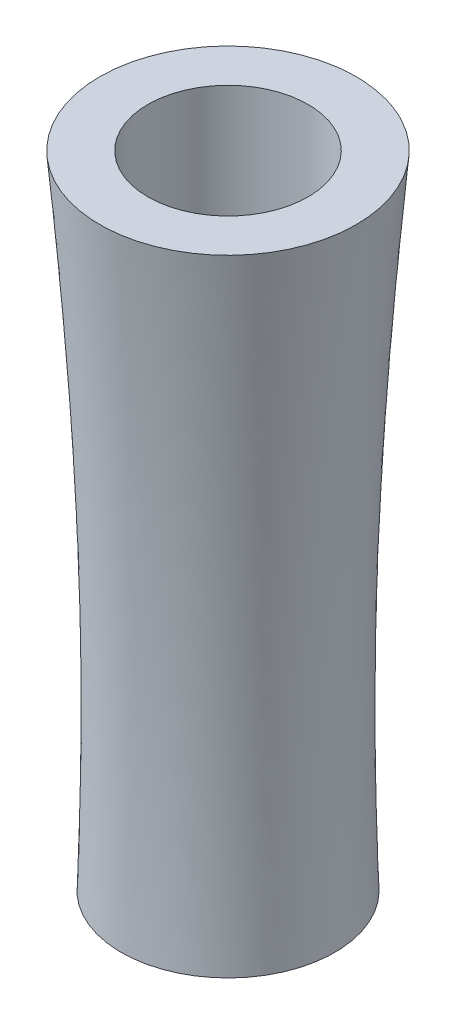
ISO-10303-21;
HEADER;
FILE_DESCRIPTION(('STEP AP214'),'2;1');
FILE_NAME('part.step','',(''),(''),'','','');
FILE_SCHEMA(('AUTOMOTIVE_DESIGN { 1 0 10303 214 1 1 1 1 }'));
ENDSEC;
DATA;
#1=APPLICATION_CONTEXT('core data for automotive mechanical design processes');
#2=APPLICATION_PROTOCOL_DEFINITION('international standard','automotive_design',2000,#1);
#3=PRODUCT_CONTEXT('',#1,'mechanical');
#4=PRODUCT('Part','Part','',(#3));
#5=PRODUCT_RELATED_PRODUCT_CATEGORY('part','',(#4));
#6=PRODUCT_DEFINITION_FORMATION('','',#4);
#7=PRODUCT_DEFINITION_CONTEXT('part definition',#1,'design');
#8=PRODUCT_DEFINITION('design','',#6,#7);
#9=PRODUCT_DEFINITION_SHAPE('','',#8);
#10=(LENGTH_UNIT() NAMED_UNIT(*) SI_UNIT(.MILLI.,.METRE.));
#11=(NAMED_UNIT(*) PLANE_ANGLE_UNIT() SI_UNIT($,.RADIAN.));
#12=(NAMED_UNIT(*) SI_UNIT($,.STERADIAN.) SOLID_ANGLE_UNIT());
#13=UNCERTAINTY_MEASURE_WITH_UNIT(LENGTH_MEASURE(1.E-05),#10,'distance_accuracy_value','');
#14=(GEOMETRIC_REPRESENTATION_CONTEXT(3) GLOBAL_UNCERTAINTY_ASSIGNED_CONTEXT((#13)) GLOBAL_UNIT_ASSIGNED_CONTEXT((#10,
#11,#12)) REPRESENTATION_CONTEXT('',''));
#15=CARTESIAN_POINT('',(0.,0.,0.));
#16=DIRECTION('',(0.,0.,1.));
#17=DIRECTION('',(1.,0.,0.));
#18=AXIS2_PLACEMENT_3D('',#15,#16,#17);
#19=CARTESIAN_POINT('',(0.,60.,0.));
#20=DIRECTION('',(0.,1.,0.));
#21=DIRECTION('',(0.,0.,1.));
#22=AXIS2_PLACEMENT_3D('',#19,#20,#21);
#23=PLANE('',#22);
#24=CARTESIAN_POINT('',(0.,60.,0.));
#25=DIRECTION('',(0.,1.,0.));
#26=DIRECTION('',(0.,0.,1.));
#27=AXIS2_PLACEMENT_3D('',#24,#25,#26);
#28=CIRCLE('',#27,7.5);
#29=CARTESIAN_POINT('',(0.,60.,7.5));
#30=VERTEX_POINT('',#29);
#31=EDGE_CURVE('E63',#30,#30,#28,.T.);
#32=ORIENTED_EDGE('',*,*,#31,.F.);
#33=EDGE_LOOP('',(#32));
#34=FACE_BOUND('',#33,.T.);
#35=CARTESIAN_POINT('',(0.,60.,0.));
#36=DIRECTION('',(0.,1.,0.));
#37=DIRECTION('',(0.,0.,1.));
#38=AXIS2_PLACEMENT_3D('',#35,#36,#37);
#39=CIRCLE('',#38,12.);
#40=CARTESIAN_POINT('',(-2.04829247959977,60.,11.8238952091946));
#41=VERTEX_POINT('',#40);
#42=EDGE_CURVE('E11',#41,#41,#39,.T.);
#43=ORIENTED_EDGE('',*,*,#42,.T.);
#44=EDGE_LOOP('',(#43));
#45=FACE_BOUND('',#44,.T.);
#46=ADVANCED_FACE('F47',(#34,#45),#23,.T.);
#47=CARTESIAN_POINT('',(0.,0.,0.));
#48=DIRECTION('',(0.,1.,0.));
#49=DIRECTION('',(0.,0.,1.));
#50=AXIS2_PLACEMENT_3D('',#47,#48,#49);
#51=PLANE('',#50);
#52=CARTESIAN_POINT('',(0.,0.,0.));
#53=DIRECTION('',(0.,1.,0.));
#54=DIRECTION('',(0.,0.,1.));
#55=AXIS2_PLACEMENT_3D('',#52,#53,#54);
#56=CIRCLE('',#55,7.5);
#57=CARTESIAN_POINT('',(0.,0.,7.5));
#58=VERTEX_POINT('',#57);
#59=EDGE_CURVE('E51',#58,#58,#56,.T.);
#60=ORIENTED_EDGE('',*,*,#59,.T.);
#61=EDGE_LOOP('',(#60));
#62=FACE_BOUND('',#61,.T.);
#63=CARTESIAN_POINT('',(0.,0.,0.));
#64=DIRECTION('',(0.,1.,0.));
#65=DIRECTION('',(0.,0.,1.));
#66=AXIS2_PLACEMENT_3D('',#63,#64,#65);
#67=CIRCLE('',#66,10.);
#68=CARTESIAN_POINT('',(6.31596393462323,0.,7.75297359575916));
#69=VERTEX_POINT('',#68);
#70=EDGE_CURVE('E56',#69,#69,#67,.T.);
#71=ORIENTED_EDGE('',*,*,#70,.F.);
#72=EDGE_LOOP('',(#71));
#73=FACE_BOUND('',#72,.T.);
#74=ADVANCED_FACE('F83',(#62,#73),#51,.F.);
#75=CARTESIAN_POINT('',(6.31596393462323,0.,7.75297359575916));
#76=CARTESIAN_POINT('',(-2.04829247959977,60.,11.8238952091946));
#77=CARTESIAN_POINT('',(21.8219111261415,0.,-4.8789542734873));
#78=CARTESIAN_POINT('',(21.5994979387894,60.,15.9204801683941));
#79=CARTESIAN_POINT('',(9.18998325689508,0.,-20.3849014650056));
#80=CARTESIAN_POINT('',(25.696082897989,60.,-7.72731024999507));
#81=CARTESIAN_POINT('',(-6.31596393462323,0.,-7.75297359575916));
#82=CARTESIAN_POINT('',(2.04829247959977,60.,-11.8238952091946));
#83=CARTESIAN_POINT('',(-21.8219111261415,0.,4.87895427348729));
#84=CARTESIAN_POINT('',(-21.5994979387894,60.,-15.9204801683941));
#85=CARTESIAN_POINT('',(-9.18998325689508,0.,20.3849014650056));
#86=CARTESIAN_POINT('',(-25.696082897989,60.,7.72731024999507));
#87=CARTESIAN_POINT('',(6.31596393462323,0.,7.75297359575916));
#88=CARTESIAN_POINT('',(-2.04829247959977,60.,11.8238952091946));
#89=(BOUNDED_SURFACE() B_SPLINE_SURFACE(3,1,((#75,#76),(#77,#78),(#79,#80),(#81,#82),(#83,#84),
(#85,#86),(#87,#88)),.UNSPECIFIED.,.T.,.F.,.F.) B_SPLINE_SURFACE_WITH_KNOTS((4,3,4),(2,2),(0.,
0.5,1.),(0.,1.),.UNSPECIFIED.) GEOMETRIC_REPRESENTATION_ITEM() RATIONAL_B_SPLINE_SURFACE(((1.,
1.),(0.333333333333333,0.333333333333333),(0.333333333333333,0.333333333333333),(1.,1.),
(0.333333333333334,0.333333333333333),(0.333333333333334,0.333333333333333),(1.,1.))) REPRESENTATION_ITEM('') SURFACE());
#90=CARTESIAN_POINT('',(6.31596393462323,0.,7.75297359575916));
#91=CARTESIAN_POINT('',(6.22883626364174,0.625,7.79537902923244));
#92=CARTESIAN_POINT('',(6.14170859266025,1.25,7.83778446270573));
#93=CARTESIAN_POINT('',(5.96745325069727,2.5,7.9225953296523));
#94=CARTESIAN_POINT('',(5.88032557971578,3.125,7.96500076312559));
#95=CARTESIAN_POINT('',(5.7060702377528,4.375,8.04981163007216));
#96=CARTESIAN_POINT('',(5.61894256677131,5.,8.09221706354544));
#97=CARTESIAN_POINT('',(5.44468722480833,6.25,8.17702793049201));
#98=CARTESIAN_POINT('',(5.35755955382684,6.875,8.2194333639653));
#99=CARTESIAN_POINT('',(5.18330421186386,8.125,8.30424423091187));
#100=CARTESIAN_POINT('',(5.09617654088237,8.75,8.34664966438516));
#101=CARTESIAN_POINT('',(4.9219211989194,10.,8.43146053133173));
#102=CARTESIAN_POINT('',(4.83479352793791,10.625,8.47386596480502));
#103=CARTESIAN_POINT('',(4.66053818597493,11.875,8.55867683175159));
#104=CARTESIAN_POINT('',(4.57341051499344,12.5,8.60108226522487));
#105=CARTESIAN_POINT('',(4.39915517303046,13.75,8.68589313217145));
#106=CARTESIAN_POINT('',(4.31202750204897,14.375,8.72829856564473));
#107=CARTESIAN_POINT('',(4.13777216008599,15.625,8.8131094325913));
#108=CARTESIAN_POINT('',(4.0506444891045,16.25,8.85551486606459));
#109=CARTESIAN_POINT('',(3.87638914714152,17.5,8.94032573301116));
#110=CARTESIAN_POINT('',(3.78926147616003,18.125,8.98273116648445));
#111=CARTESIAN_POINT('',(3.61500613419705,19.375,9.06754203343102));
#112=CARTESIAN_POINT('',(3.52787846321556,20.,9.10994746690431));
#113=CARTESIAN_POINT('',(3.35362312125258,21.25,9.19475833385088));
#114=CARTESIAN_POINT('',(3.26649545027109,21.875,9.23716376732416));
#115=CARTESIAN_POINT('',(3.09224010830811,23.125,9.32197463427073));
#116=CARTESIAN_POINT('',(3.00511243732663,23.75,9.36438006774402));
#117=CARTESIAN_POINT('',(2.83085709536365,25.,9.44919093469059));
#118=CARTESIAN_POINT('',(2.74372942438216,25.625,9.49159636816388));
#119=CARTESIAN_POINT('',(2.56947408241918,26.875,9.57640723511045));
#120=CARTESIAN_POINT('',(2.48234641143769,27.5,9.61881266858374));
#121=CARTESIAN_POINT('',(2.30809106947471,28.75,9.70362353553031));
#122=CARTESIAN_POINT('',(2.22096339849322,29.375,9.74602896900359));
#123=CARTESIAN_POINT('',(2.04670805653024,30.625,9.83083983595017));
#124=CARTESIAN_POINT('',(1.95958038554875,31.25,9.87324526942345));
#125=CARTESIAN_POINT('',(1.78532504358577,32.5,9.95805613637002));
#126=CARTESIAN_POINT('',(1.69819737260428,33.125,10.0004615698433));
#127=CARTESIAN_POINT('',(1.5239420306413,34.375,10.0852724367899));
#128=CARTESIAN_POINT('',(1.43681435965981,35.,10.1276778702632));
#129=CARTESIAN_POINT('',(1.26255901769683,36.25,10.2124887372097));
#130=CARTESIAN_POINT('',(1.17543134671534,36.875,10.254894170683));
#131=CARTESIAN_POINT('',(1.00117600475237,38.125,10.3397050376296));
#132=CARTESIAN_POINT('',(0.914048333770876,38.75,10.3821104711029));
#133=CARTESIAN_POINT('',(0.739792991807897,40.,10.4669213380495));
#134=CARTESIAN_POINT('',(0.652665320826407,40.625,10.5093267715227));
#135=CARTESIAN_POINT('',(0.478409978863428,41.875,10.5941376384693));
#136=CARTESIAN_POINT('',(0.391282307881939,42.5,10.6365430719426));
#137=CARTESIAN_POINT('',(0.21702696591896,43.75,10.7213539388892));
#138=CARTESIAN_POINT('',(0.12989929493747,44.375,10.7637593723625));
#139=CARTESIAN_POINT('',(-0.0443560470255091,45.625,10.848570239309));
#140=CARTESIAN_POINT('',(-0.131483718006999,46.25,10.8909756727823));
#141=CARTESIAN_POINT('',(-0.305739059969978,47.5,10.9757865397289));
#142=CARTESIAN_POINT('',(-0.392866730951467,48.125,11.0181919732022));
#143=CARTESIAN_POINT('',(-0.567122072914446,49.375,11.1030028401487));
#144=CARTESIAN_POINT('',(-0.654249743895936,50.,11.145408273622));
#145=CARTESIAN_POINT('',(-0.828505085858915,51.25,11.2302191405686));
#146=CARTESIAN_POINT('',(-0.915632756840405,51.875,11.2726245740419));
#147=CARTESIAN_POINT('',(-1.08988809880338,53.125,11.3574354409885));
#148=CARTESIAN_POINT('',(-1.17701576978487,53.75,11.3998408744617));
#149=CARTESIAN_POINT('',(-1.35127111174785,55.,11.4846517414083));
#150=CARTESIAN_POINT('',(-1.43839878272934,55.625,11.5270571748816));
#151=CARTESIAN_POINT('',(-1.61265412469232,56.875,11.6118680418282));
#152=CARTESIAN_POINT('',(-1.69978179567381,57.5,11.6542734753015));
#153=CARTESIAN_POINT('',(-1.87403713763679,58.75,11.739084342248));
#154=CARTESIAN_POINT('',(-1.96116480861828,59.375,11.7814897757213));
#155=CARTESIAN_POINT('',(-2.04829247959977,60.,11.8238952091946));
#156=B_SPLINE_CURVE_WITH_KNOTS('',3,(#90,#91,#92,#93,#94,#95,#96,#97,#98,#99,#100,#101,#102,
#103,#104,#105,#106,#107,#108,#109,#110,#111,#112,#113,#114,#115,#116,#117,#118,#119,#120,#121,
#122,#123,#124,#125,#126,#127,#128,#129,#130,#131,#132,#133,#134,#135,#136,#137,#138,#139,#140,
#141,#142,#143,#144,#145,#146,#147,#148,#149,#150,#151,#152,#153,#154,#155),.UNSPECIFIED.,.F.,
.F.,(4,2,2,2,2,2,2,2,2,2,2,2,2,2,2,2,2,2,2,2,2,2,2,2,2,2,2,2,2,2,2,2,4),(0.,1.89740087133648,
3.79480174267297,5.69220261400945,7.58960348534593,9.48700435668241,11.3844052280189,
13.2818060993554,15.1792069706919,17.0766078420283,18.9740087133648,20.8714095847013,
22.7688104560378,24.6662113273743,26.5636121987108,28.4610130700472,30.3584139413837,
32.2558148127202,34.1532156840567,36.0506165553932,37.9480174267296,39.8454182980661,
41.7428191694026,43.6402200407391,45.5376209120756,47.4350217834121,49.3324226547485,
51.229823526085,53.1272243974215,55.024625268758,56.9220261400945,58.8194270114309,
60.7168278827674),.UNSPECIFIED.);
#157=EDGE_CURVE('BSEAM92',#69,#41,#156,.T.);
#158=ORIENTED_EDGE('',*,*,#70,.T.);
#159=ORIENTED_EDGE('',*,*,#42,.F.);
#160=ORIENTED_EDGE('',*,*,#157,.T.);
#161=ORIENTED_EDGE('',*,*,#157,.F.);
#162=EDGE_LOOP('',(#158,#160,#159,#161));
#163=FACE_BOUND('',#162,.T.);
#164=ADVANCED_FACE('F92',(#163),#89,.T.);
#165=CARTESIAN_POINT('',(0.,-0.000100000000002876,0.));
#166=DIRECTION('',(0.,1.,0.));
#167=DIRECTION('',(0.,0.,1.));
#168=AXIS2_PLACEMENT_3D('',#165,#166,#167);
#169=CYLINDRICAL_SURFACE('',#168,7.5);
#170=ORIENTED_EDGE('',*,*,#31,.T.);
#171=EDGE_LOOP('',(#170));
#172=FACE_BOUND('',#171,.T.);
#173=ORIENTED_EDGE('',*,*,#59,.F.);
#174=EDGE_LOOP('',(#173));
#175=FACE_BOUND('',#174,.T.);
#176=ADVANCED_FACE('F94',(#172,#175),#169,.F.);
#177=CLOSED_SHELL('',(#46,#74,#164,#176));
#178=MANIFOLD_SOLID_BREP('B2',#177);
#179=ADVANCED_BREP_SHAPE_REPRESENTATION('',(#18,#178),#14);
#180=SHAPE_DEFINITION_REPRESENTATION(#9,#179);
ENDSEC;
END-ISO-10303-21;
